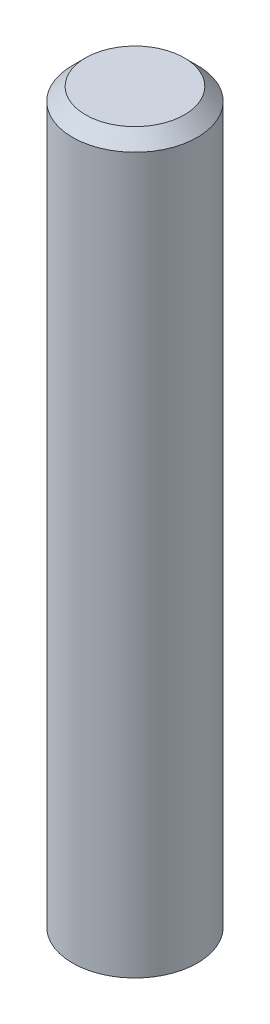
ISO-10303-21;
HEADER;
FILE_DESCRIPTION(('STEP AP214'),'2;1');
FILE_NAME('part.step','',(''),(''),'','','');
FILE_SCHEMA(('AUTOMOTIVE_DESIGN { 1 0 10303 214 1 1 1 1 }'));
ENDSEC;
DATA;
#1=APPLICATION_CONTEXT('core data for automotive mechanical design processes');
#2=APPLICATION_PROTOCOL_DEFINITION('international standard','automotive_design',2000,#1);
#3=PRODUCT_CONTEXT('',#1,'mechanical');
#4=PRODUCT('Part','Part','',(#3));
#5=PRODUCT_RELATED_PRODUCT_CATEGORY('part','',(#4));
#6=PRODUCT_DEFINITION_FORMATION('','',#4);
#7=PRODUCT_DEFINITION_CONTEXT('part definition',#1,'design');
#8=PRODUCT_DEFINITION('design','',#6,#7);
#9=PRODUCT_DEFINITION_SHAPE('','',#8);
#10=(LENGTH_UNIT() NAMED_UNIT(*) SI_UNIT(.MILLI.,.METRE.));
#11=(NAMED_UNIT(*) PLANE_ANGLE_UNIT() SI_UNIT($,.RADIAN.));
#12=(NAMED_UNIT(*) SI_UNIT($,.STERADIAN.) SOLID_ANGLE_UNIT());
#13=UNCERTAINTY_MEASURE_WITH_UNIT(LENGTH_MEASURE(1.E-05),#10,'distance_accuracy_value','');
#14=(GEOMETRIC_REPRESENTATION_CONTEXT(3) GLOBAL_UNCERTAINTY_ASSIGNED_CONTEXT((#13)) GLOBAL_UNIT_ASSIGNED_CONTEXT((#10,
#11,#12)) REPRESENTATION_CONTEXT('',''));
#15=CARTESIAN_POINT('',(0.,0.,0.));
#16=DIRECTION('',(0.,0.,1.));
#17=DIRECTION('',(1.,0.,0.));
#18=AXIS2_PLACEMENT_3D('',#15,#16,#17);
#19=CARTESIAN_POINT('',(0.,28.,0.));
#20=DIRECTION('',(0.,-1.,0.));
#21=DIRECTION('',(0.,0.,-1.));
#22=AXIS2_PLACEMENT_3D('',#19,#20,#21);
#23=CYLINDRICAL_SURFACE('',#22,2.4);
#24=CARTESIAN_POINT('',(0.,10.25,-2.4));
#25=CARTESIAN_POINT('',(-0.0653820626995401,10.2499957495547,-2.3999962453178));
#26=CARTESIAN_POINT('',(-0.13083201440909,10.2448402352979,-2.39730015271642));
#27=CARTESIAN_POINT('',(-0.259776507569498,10.224456228475,-2.38678022269838));
#28=CARTESIAN_POINT('',(-0.323267568639213,10.2092107790212,-2.37894775342112));
#29=CARTESIAN_POINT('',(-0.446236618529173,10.1694155829661,-2.35896986484597));
#30=CARTESIAN_POINT('',(-0.505729517436815,10.1449029579478,-2.34684166505967));
#31=CARTESIAN_POINT('',(-0.61965826407492,10.0874729828373,-2.31936689663293));
#32=CARTESIAN_POINT('',(-0.674094242274499,10.0545558496646,-2.30402041105792));
#33=CARTESIAN_POINT('',(-0.780283096581671,9.9788656477945,-2.27034276793363));
#34=CARTESIAN_POINT('',(-0.831641066474258,9.93559650042711,-2.25188342755513));
#35=CARTESIAN_POINT('',(-0.926739832328804,9.8415069356615,-2.21444578371119));
#36=CARTESIAN_POINT('',(-0.970474289819358,9.79068029912653,-2.1954670634381));
#37=CARTESIAN_POINT('',(-1.05286522407152,9.6776963883627,-2.15724602062454));
#38=CARTESIAN_POINT('',(-1.09076238534589,9.61494076816821,-2.13812119230245));
#39=CARTESIAN_POINT('',(-1.15530733645859,9.48286195559169,-2.10395033006001));
#40=CARTESIAN_POINT('',(-1.18196360675716,9.41354376272972,-2.08890122437185));
#41=CARTESIAN_POINT('',(-1.22145864099901,9.27463008459508,-2.06604313456441));
#42=CARTESIAN_POINT('',(-1.23504864834831,9.20531574664471,-2.05784463281526));
#43=CARTESIAN_POINT('',(-1.25029995651336,9.06494772118171,-2.048618844409));
#44=CARTESIAN_POINT('',(-1.25197498451371,8.99389612992185,-2.04758330537843));
#45=CARTESIAN_POINT('',(-1.24389775573865,8.86221602084039,-2.05249269336269));
#46=CARTESIAN_POINT('',(-1.23563023769569,8.80145386879021,-2.05753087005824));
#47=CARTESIAN_POINT('',(-1.21049717264733,8.68234782305994,-2.07241594555192));
#48=CARTESIAN_POINT('',(-1.19362846394487,8.62400482716698,-2.08226461257397));
#49=CARTESIAN_POINT('',(-1.15149184379785,8.50973146408396,-2.10586275156516));
#50=CARTESIAN_POINT('',(-1.12604029436411,8.45388703668264,-2.11969645162352));
#51=CARTESIAN_POINT('',(-1.06760716137716,8.34698376123161,-2.14971929755412));
#52=CARTESIAN_POINT('',(-1.03462220546489,8.2959270709139,-2.16590949714178));
#53=CARTESIAN_POINT('',(-0.956716188418476,8.19256969282888,-2.20153844621802));
#54=CARTESIAN_POINT('',(-0.91077290226798,8.14108447358054,-2.22111574758152));
#55=CARTESIAN_POINT('',(-0.810864924304848,8.04619293418195,-2.25950510213463));
#56=CARTESIAN_POINT('',(-0.756895785036052,8.00279112360945,-2.27831672362069));
#57=CARTESIAN_POINT('',(-0.638779736914279,7.92305759309437,-2.31429689763359));
#58=CARTESIAN_POINT('',(-0.57423909286209,7.88723832196851,-2.33132058635683));
#59=CARTESIAN_POINT('',(-0.438940450574653,7.82727108894281,-2.3605305663822));
#60=CARTESIAN_POINT('',(-0.368187835461916,7.80311313737348,-2.37272099649017));
#61=CARTESIAN_POINT('',(-0.229090508112969,7.7692746478307,-2.38997771463726));
#62=CARTESIAN_POINT('',(-0.161074958355469,7.75851419560936,-2.39557310690375));
#63=CARTESIAN_POINT('',(-0.0239853437695565,7.74834467485555,-2.40085813878457));
#64=CARTESIAN_POINT('',(0.0450881331676905,7.74892951518618,-2.40055094741851));
#65=CARTESIAN_POINT('',(0.176028197472893,7.76086146258911,-2.39435677425873));
#66=CARTESIAN_POINT('',(0.238005460952369,7.77128278177368,-2.38894980436383));
#67=CARTESIAN_POINT('',(0.359191509607861,7.80109373451954,-2.37375486618815));
#68=CARTESIAN_POINT('',(0.41839999982792,7.82048432118655,-2.36396643232126));
#69=CARTESIAN_POINT('',(0.534206311232372,7.86812128859939,-2.34055732415115));
#70=CARTESIAN_POINT('',(0.590693350972447,7.89658875747268,-2.3268419581348));
#71=CARTESIAN_POINT('',(0.698261815233752,7.96131073532653,-2.29685727339073));
#72=CARTESIAN_POINT('',(0.749341032319596,7.99756840605849,-2.28058691841234));
#73=CARTESIAN_POINT('',(0.850302526226008,8.08118650816692,-2.24502557025226));
#74=CARTESIAN_POINT('',(0.899504807801502,8.12931037625952,-2.22559650534946));
#75=CARTESIAN_POINT('',(0.989469906640362,8.23307717403106,-2.18708686722288));
#76=CARTESIAN_POINT('',(1.0302256546104,8.28872633812912,-2.16800659800129));
#77=CARTESIAN_POINT('',(1.10448602448003,8.41011156241737,-2.13118077459024));
#78=CARTESIAN_POINT('',(1.13740978102775,8.47625223987512,-2.11358371682357));
#79=CARTESIAN_POINT('',(1.19131395184448,8.61432716358647,-2.0836827441723));
#80=CARTESIAN_POINT('',(1.21231087096255,8.68625324552331,-2.07137152032505));
#81=CARTESIAN_POINT('',(1.23973397491112,8.82637619417581,-2.05506496181069));
#82=CARTESIAN_POINT('',(1.24738401005433,8.8942501479276,-2.05037427739475));
#83=CARTESIAN_POINT('',(1.25148161879066,9.03044661828163,-2.04787785786216));
#84=CARTESIAN_POINT('',(1.24793562623097,9.09876885475645,-2.05006816854741));
#85=CARTESIAN_POINT('',(1.23090833456257,9.22586520075527,-2.06032556826143));
#86=CARTESIAN_POINT('',(1.21857619416558,9.28485596149396,-2.06771177578076));
#87=CARTESIAN_POINT('',(1.18583469745115,9.39983978522074,-2.08666041058833));
#88=CARTESIAN_POINT('',(1.16542252753559,9.45583179627651,-2.09822429248832));
#89=CARTESIAN_POINT('',(1.11561451222069,9.56734244427666,-2.12514791377387));
#90=CARTESIAN_POINT('',(1.08571484619992,9.62258617052436,-2.14070774016596));
#91=CARTESIAN_POINT('',(1.01830205671587,9.72764080169875,-2.17358395973827));
#92=CARTESIAN_POINT('',(0.98078484858099,9.77744876974392,-2.19090129282483));
#93=CARTESIAN_POINT('',(0.893246860653107,9.87726449694916,-2.22815299944168));
#94=CARTESIAN_POINT('',(0.842220071759926,9.92638140586767,-2.24812349448914));
#95=CARTESIAN_POINT('',(0.732172376475874,10.0155991341121,-2.28633219809612));
#96=CARTESIAN_POINT('',(0.673146696063395,10.0556945307687,-2.30456936099745));
#97=CARTESIAN_POINT('',(0.547252210440891,10.1261918065724,-2.33769600023586));
#98=CARTESIAN_POINT('',(0.480265969057813,10.1564151019037,-2.35252250341793));
#99=CARTESIAN_POINT('',(0.341227343881983,10.204760216312,-2.37665807188885));
#100=CARTESIAN_POINT('',(0.269189448632101,10.2229151958275,-2.38598224807952));
#101=CARTESIAN_POINT('',(0.163614877313132,10.2396808508524,-2.39463862871186));
#102=CARTESIAN_POINT('',(0.131051052299716,10.2435439804453,-2.39664287515046));
#103=CARTESIAN_POINT('',(0.0656638646401358,10.2487046511003,-2.39932451855381));
#104=CARTESIAN_POINT('',(0.0328404962216147,10.2500021349393,-2.40000188592439));
#105=CARTESIAN_POINT('',(0.,10.25,-2.4));
#106=B_SPLINE_CURVE_WITH_KNOTS('',3,(#24,#25,#26,#27,#28,#29,#30,#31,#32,#33,#34,#35,#36,#37,
#38,#39,#40,#41,#42,#43,#44,#45,#46,#47,#48,#49,#50,#51,#52,#53,#54,#55,#56,#57,#58,#59,#60,#61,
#62,#63,#64,#65,#66,#67,#68,#69,#70,#71,#72,#73,#74,#75,#76,#77,#78,#79,#80,#81,#82,#83,#84,#85,
#86,#87,#88,#89,#90,#91,#92,#93,#94,#95,#96,#97,#98,#99,#100,#101,#102,#103,#104,#105),
.UNSPECIFIED.,.T.,.F.,(4,2,2,2,2,2,2,2,2,2,2,2,2,2,2,2,2,2,2,2,2,2,2,2,2,2,2,2,2,2,2,2,2,2,2,2,
2,2,2,2,4),(0.,0.196013421873564,0.392357098232419,0.587922472575034,0.783482799907089,
0.991563403316049,1.19981619591753,1.42596466200295,1.65194220844304,1.86397306038913,
2.07575959309066,2.25948381804613,2.44327562661657,2.63127969858339,2.81936809684735,
3.03362862198505,3.24800832321602,3.47403926669909,3.69987623562349,3.90599431763878,
4.11200174065729,4.30037013919828,4.48875855902396,4.68213991270166,4.87559990139575,
5.08922943453688,5.30303704839841,5.52965686332736,5.75596230358888,5.96014232368022,
6.16420503217309,6.34556636069462,6.52699089782317,6.72038407361921,6.91388122570575,
7.13364717795444,7.35354487676688,7.57722468676271,7.80028731678874,7.89873992301308,
7.99719472505881),.UNSPECIFIED.);
#107=CARTESIAN_POINT('',(0.,10.25,-2.4));
#108=VERTEX_POINT('',#107);
#109=EDGE_CURVE('E11',#108,#108,#106,.T.);
#110=ORIENTED_EDGE('',*,*,#109,.T.);
#111=EDGE_LOOP('',(#110));
#112=FACE_BOUND('',#111,.T.);
#113=CARTESIAN_POINT('',(0.,27.5,0.));
#114=DIRECTION('',(0.,1.,0.));
#115=DIRECTION('',(0.,0.,1.));
#116=AXIS2_PLACEMENT_3D('',#113,#114,#115);
#117=CIRCLE('',#116,2.4);
#118=CARTESIAN_POINT('',(0.,27.5,2.4));
#119=VERTEX_POINT('',#118);
#120=EDGE_CURVE('E45',#119,#119,#117,.F.);
#121=ORIENTED_EDGE('',*,*,#120,.T.);
#122=EDGE_LOOP('',(#121));
#123=FACE_BOUND('',#122,.T.);
#124=CARTESIAN_POINT('',(0.,0.,0.));
#125=DIRECTION('',(0.,1.,0.));
#126=DIRECTION('',(0.,0.,1.));
#127=AXIS2_PLACEMENT_3D('',#124,#125,#126);
#128=CIRCLE('',#127,2.4);
#129=CARTESIAN_POINT('',(0.,0.,2.4));
#130=VERTEX_POINT('',#129);
#131=EDGE_CURVE('E57',#130,#130,#128,.T.);
#132=ORIENTED_EDGE('',*,*,#131,.T.);
#133=EDGE_LOOP('',(#132));
#134=FACE_BOUND('',#133,.T.);
#135=ADVANCED_FACE('F35',(#112,#123,#134),#23,.T.);
#136=CARTESIAN_POINT('',(0.,28.,0.));
#137=DIRECTION('',(0.,1.,0.));
#138=DIRECTION('',(0.,0.,1.));
#139=AXIS2_PLACEMENT_3D('',#136,#137,#138);
#140=PLANE('',#139);
#141=CARTESIAN_POINT('',(0.,28.,0.));
#142=DIRECTION('',(0.,1.,0.));
#143=DIRECTION('',(0.,0.,1.));
#144=AXIS2_PLACEMENT_3D('',#141,#142,#143);
#145=CIRCLE('',#144,1.9);
#146=CARTESIAN_POINT('',(0.,28.,1.9));
#147=VERTEX_POINT('',#146);
#148=EDGE_CURVE('E60',#147,#147,#145,.T.);
#149=ORIENTED_EDGE('',*,*,#148,.T.);
#150=EDGE_LOOP('',(#149));
#151=FACE_BOUND('',#150,.T.);
#152=ADVANCED_FACE('F74',(#151),#140,.T.);
#153=CARTESIAN_POINT('',(0.,0.,0.));
#154=DIRECTION('',(0.,1.,0.));
#155=DIRECTION('',(0.,0.,1.));
#156=AXIS2_PLACEMENT_3D('',#153,#154,#155);
#157=PLANE('',#156);
#158=ORIENTED_EDGE('',*,*,#131,.F.);
#159=EDGE_LOOP('',(#158));
#160=FACE_BOUND('',#159,.T.);
#161=ADVANCED_FACE('F71',(#160),#157,.F.);
#162=CARTESIAN_POINT('',(0.,28.,0.));
#163=DIRECTION('',(0.,-1.,0.));
#164=DIRECTION('',(0.,0.,-1.));
#165=AXIS2_PLACEMENT_3D('',#162,#163,#164);
#166=CONICAL_SURFACE('',#165,1.9,0.785398163397445);
#167=ORIENTED_EDGE('',*,*,#120,.F.);
#168=EDGE_LOOP('',(#167));
#169=FACE_BOUND('',#168,.T.);
#170=ORIENTED_EDGE('',*,*,#148,.F.);
#171=EDGE_LOOP('',(#170));
#172=FACE_BOUND('',#171,.T.);
#173=ADVANCED_FACE('F37',(#169,#172),#166,.T.);
#174=CARTESIAN_POINT('',(0.,9.,-2.4));
#175=DIRECTION('',(0.,0.,-1.));
#176=DIRECTION('',(-1.,0.,0.));
#177=AXIS2_PLACEMENT_3D('',#174,#175,#176);
#178=CYLINDRICAL_SURFACE('',#177,1.25);
#179=CARTESIAN_POINT('',(0.,9.,0.600000000000001));
#180=DIRECTION('',(0.,0.,-1.));
#181=DIRECTION('',(-1.,0.,0.));
#182=AXIS2_PLACEMENT_3D('',#179,#180,#181);
#183=CIRCLE('',#182,1.25);
#184=CARTESIAN_POINT('',(-1.25,9.,0.600000000000001));
#185=VERTEX_POINT('',#184);
#186=EDGE_CURVE('E55',#185,#185,#183,.T.);
#187=ORIENTED_EDGE('',*,*,#186,.F.);
#188=EDGE_LOOP('',(#187));
#189=FACE_BOUND('',#188,.T.);
#190=ORIENTED_EDGE('',*,*,#109,.F.);
#191=EDGE_LOOP('',(#190));
#192=FACE_BOUND('',#191,.T.);
#193=ADVANCED_FACE('F51',(#189,#192),#178,.F.);
#194=CARTESIAN_POINT('',(0.,9.,0.600000000000001));
#195=DIRECTION('',(0.,0.,-1.));
#196=DIRECTION('',(-1.,0.,0.));
#197=AXIS2_PLACEMENT_3D('',#194,#195,#196);
#198=CONICAL_SURFACE('',#197,1.25,1.02974425867665);
#199=CARTESIAN_POINT('',(0.,9.,1.35107577378445));
#200=VERTEX_POINT('',#199);
#201=VERTEX_LOOP('',#200);
#202=FACE_BOUND('',#201,.T.);
#203=ORIENTED_EDGE('',*,*,#186,.T.);
#204=EDGE_LOOP('',(#203));
#205=FACE_BOUND('',#204,.T.);
#206=ADVANCED_FACE('F48',(#202,#205),#198,.F.);
#207=CLOSED_SHELL('',(#135,#152,#161,#173,#193,#206));
#208=MANIFOLD_SOLID_BREP('B2',#207);
#209=ADVANCED_BREP_SHAPE_REPRESENTATION('',(#18,#208),#14);
#210=SHAPE_DEFINITION_REPRESENTATION(#9,#209);
ENDSEC;
END-ISO-10303-21;
